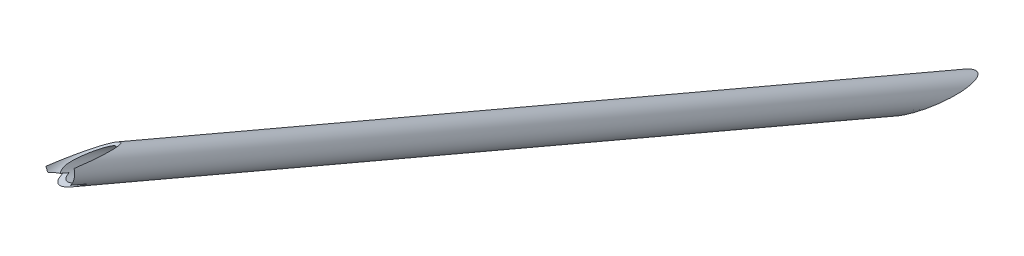
ISO-10303-21;
HEADER;
FILE_DESCRIPTION(('STEP AP214'),'2;1');
FILE_NAME('part.step','',(''),(''),'','','');
FILE_SCHEMA(('AUTOMOTIVE_DESIGN { 1 0 10303 214 1 1 1 1 }'));
ENDSEC;
DATA;
#1=APPLICATION_CONTEXT('core data for automotive mechanical design processes');
#2=APPLICATION_PROTOCOL_DEFINITION('international standard','automotive_design',2000,#1);
#3=PRODUCT_CONTEXT('',#1,'mechanical');
#4=PRODUCT('Part','Part','',(#3));
#5=PRODUCT_RELATED_PRODUCT_CATEGORY('part','',(#4));
#6=PRODUCT_DEFINITION_FORMATION('','',#4);
#7=PRODUCT_DEFINITION_CONTEXT('part definition',#1,'design');
#8=PRODUCT_DEFINITION('design','',#6,#7);
#9=PRODUCT_DEFINITION_SHAPE('','',#8);
#10=(LENGTH_UNIT() NAMED_UNIT(*) SI_UNIT(.MILLI.,.METRE.));
#11=(NAMED_UNIT(*) PLANE_ANGLE_UNIT() SI_UNIT($,.RADIAN.));
#12=(NAMED_UNIT(*) SI_UNIT($,.STERADIAN.) SOLID_ANGLE_UNIT());
#13=UNCERTAINTY_MEASURE_WITH_UNIT(LENGTH_MEASURE(1.E-05),#10,'distance_accuracy_value','');
#14=(GEOMETRIC_REPRESENTATION_CONTEXT(3) GLOBAL_UNCERTAINTY_ASSIGNED_CONTEXT((#13)) GLOBAL_UNIT_ASSIGNED_CONTEXT((#10,
#11,#12)) REPRESENTATION_CONTEXT('',''));
#15=CARTESIAN_POINT('',(0.,0.,0.));
#16=DIRECTION('',(0.,0.,1.));
#17=DIRECTION('',(1.,0.,0.));
#18=AXIS2_PLACEMENT_3D('',#15,#16,#17);
#19=CARTESIAN_POINT('',(-224.999999999997,200.000000000002,-450.));
#20=DIRECTION('',(-0.0876619818920403,0.10519437827043,-0.990580395379929));
#21=DIRECTION('',(0.,0.99440859172735,0.105600912395818));
#22=AXIS2_PLACEMENT_3D('',#19,#20,#21);
#23=CYLINDRICAL_SURFACE('',#22,9.49999999999999);
#24=CARTESIAN_POINT('',(-224.999999999996,200.000000000002,-450.));
#25=DIRECTION('',(-0.375454370679201,0.919670602355291,-0.115065193265995));
#26=DIRECTION('',(-0.00393166272218455,0.122566257616369,0.992452545224283));
#27=AXIS2_PLACEMENT_3D('',#24,#25,#26);
#28=ELLIPSE('',#27,38.9921832232021,9.49999999999999);
#29=CARTESIAN_POINT('',(-216.195090868135,203.54419391161,-450.40282092371));
#30=VERTEX_POINT('',#29);
#31=CARTESIAN_POINT('',(-233.804909131858,196.455806088394,-449.597179076289));
#32=VERTEX_POINT('',#31);
#33=EDGE_CURVE('E88',#30,#32,#28,.T.);
#34=ORIENTED_EDGE('',*,*,#33,.T.);
#35=CARTESIAN_POINT('',(-224.999999999996,200.000000000002,-450.));
#36=DIRECTION('',(-0.00393166272218455,0.122566257616369,0.992452545224283));
#37=DIRECTION('',(-0.375454370679201,0.919670602355291,-0.115065193265995));
#38=AXIS2_PLACEMENT_3D('',#35,#36,#37);
#39=ELLIPSE('',#38,9.79516660998725,9.49999999999999);
#40=CARTESIAN_POINT('',(-232.310278324825,193.934010848774,-449.279820437099));
#41=VERTEX_POINT('',#40);
#42=EDGE_CURVE('E150',#32,#41,#39,.T.);
#43=ORIENTED_EDGE('',*,*,#42,.T.);
#44=CARTESIAN_POINT('',(-223.816060398075,198.579272477696,-436.621482498286));
#45=DIRECTION('',(0.,-0.938783490773442,0.344507703036132));
#46=DIRECTION('',(-0.0976202983177637,-0.342862242025736,-0.934299609520113));
#47=AXIS2_PLACEMENT_3D('',#44,#45,#46);
#48=ELLIPSE('',#47,21.5900591134705,9.49999999999999);
#49=CARTESIAN_POINT('',(-229.53542691,191.925076824251,-454.754165653939));
#50=VERTEX_POINT('',#49);
#51=EDGE_CURVE('E134',#50,#41,#48,.F.);
#52=ORIENTED_EDGE('',*,*,#51,.F.);
#53=CARTESIAN_POINT('',(-224.481813982683,190.718673599658,-452.360341989327));
#54=CARTESIAN_POINT('',(-224.264199666433,190.729885032806,-452.32979248487));
#55=CARTESIAN_POINT('',(-224.046282571827,190.749029245222,-452.304253143446));
#56=CARTESIAN_POINT('',(-223.61148074002,190.803406353677,-452.262531827922));
#57=CARTESIAN_POINT('',(-223.394596457844,190.838645778122,-452.246353656862));
#58=CARTESIAN_POINT('',(-222.963238330348,190.925272406231,-452.222860903455));
#59=CARTESIAN_POINT('',(-222.748768756239,190.976684626942,-452.215560138915));
#60=CARTESIAN_POINT('',(-222.324159344352,191.095427617816,-452.209528193788));
#61=CARTESIAN_POINT('',(-222.114019534059,191.162758488993,-452.21079706758));
#62=CARTESIAN_POINT('',(-221.699768680275,191.312866921458,-452.221701491588));
#63=CARTESIAN_POINT('',(-221.495652386023,191.395630539728,-452.231329518047));
#64=CARTESIAN_POINT('',(-221.094688718717,191.576058876253,-452.258880951925));
#65=CARTESIAN_POINT('',(-220.897841527132,191.673723966204,-452.276804566288));
#66=CARTESIAN_POINT('',(-220.512868010959,191.883142701053,-452.321013521688));
#67=CARTESIAN_POINT('',(-220.324738338526,191.994890875168,-452.347295621753));
#68=CARTESIAN_POINT('',(-219.958413899055,192.231549386845,-452.408440738425));
#69=CARTESIAN_POINT('',(-219.780219081483,192.356459657448,-452.443303711379));
#70=CARTESIAN_POINT('',(-219.434676286924,192.618518885972,-452.522050148405));
#71=CARTESIAN_POINT('',(-219.267347624927,192.755688660111,-452.5659491265));
#72=CARTESIAN_POINT('',(-218.945001801654,193.040711042253,-452.663274909131));
#73=CARTESIAN_POINT('',(-218.789984806616,193.188563794451,-452.716701842285));
#74=CARTESIAN_POINT('',(-218.493212918996,193.493415291667,-452.833846153052));
#75=CARTESIAN_POINT('',(-218.351465464703,193.650419087273,-452.897569248306));
#76=CARTESIAN_POINT('',(-218.082253341881,193.971578842833,-453.036212003403));
#77=CARTESIAN_POINT('',(-217.954788319448,194.135734625429,-453.111131385704));
#78=CARTESIAN_POINT('',(-217.717736128978,194.465016799177,-453.27137867765));
#79=CARTESIAN_POINT('',(-217.607800018386,194.630030305372,-453.356421542661));
#80=CARTESIAN_POINT('',(-217.402859977988,194.962200716982,-453.539407913534));
#81=CARTESIAN_POINT('',(-217.307856128146,195.129357633871,-453.637351488474));
#82=CARTESIAN_POINT('',(-217.133281755478,195.462564459564,-453.847108392444));
#83=CARTESIAN_POINT('',(-217.053683900298,195.628615814699,-453.958896570332));
#84=CARTESIAN_POINT('',(-216.90974232991,195.956547031864,-454.197420433907));
#85=CARTESIAN_POINT('',(-216.845395578067,196.118427718583,-454.324153136463));
#86=CARTESIAN_POINT('',(-216.738008601043,196.416429704804,-454.577679979249));
#87=CARTESIAN_POINT('',(-216.693376118117,196.553384504324,-454.702821997879));
#88=CARTESIAN_POINT('',(-216.615090691642,196.818791932007,-454.964973476775));
#89=CARTESIAN_POINT('',(-216.581436123165,196.947245816211,-455.101981176904));
#90=CARTESIAN_POINT('',(-216.524140871991,197.193519469318,-455.387002172547));
#91=CARTESIAN_POINT('',(-216.500492920459,197.311346908174,-455.535007387242));
#92=CARTESIAN_POINT('',(-216.461924657869,197.535067674153,-455.840840864041));
#93=CARTESIAN_POINT('',(-216.447005437903,197.64095950799,-455.998670351453));
#94=CARTESIAN_POINT('',(-216.4228736521,197.854676122407,-456.34617818612));
#95=CARTESIAN_POINT('',(-216.414810248685,197.960531759763,-456.537145036078));
#96=CARTESIAN_POINT('',(-216.406285500509,198.155916342769,-456.927384795171));
#97=CARTESIAN_POINT('',(-216.405826026521,198.245441265264,-457.126659736233));
#98=CARTESIAN_POINT('',(-216.4107315555,198.409510504716,-457.531803419678));
#99=CARTESIAN_POINT('',(-216.416112991603,198.484011852582,-457.73768917605));
#100=CARTESIAN_POINT('',(-216.431290687141,198.619322394253,-458.153675939583));
#101=CARTESIAN_POINT('',(-216.441086671542,198.680132440702,-458.363776683362));
#102=CARTESIAN_POINT('',(-216.467059283282,198.804416236727,-458.843171205751));
#103=CARTESIAN_POINT('',(-216.484240224404,198.864291088511,-459.113335997373));
#104=CARTESIAN_POINT('',(-216.522433658839,198.968239879304,-459.656472767027));
#105=CARTESIAN_POINT('',(-216.543448056677,199.012305931811,-459.929446076483));
#106=CARTESIAN_POINT('',(-216.588402824986,199.087495113404,-460.477413185907));
#107=CARTESIAN_POINT('',(-216.612348585618,199.118593921607,-460.752409806849));
#108=CARTESIAN_POINT('',(-216.662547388721,199.170027230168,-461.303122839025));
#109=CARTESIAN_POINT('',(-216.688800056408,199.190363475282,-461.578839126304));
#110=CARTESIAN_POINT('',(-216.743469206827,199.222222153879,-462.132560593233));
#111=CARTESIAN_POINT('',(-216.77189991323,199.233680047477,-462.410567954934));
#112=CARTESIAN_POINT('',(-216.830563466706,199.249010638217,-462.966596930744));
#113=CARTESIAN_POINT('',(-216.860796362458,199.252883130381,-463.244618545035));
#114=CARTESIAN_POINT('',(-216.922933299961,199.254200365461,-463.800151115029));
#115=CARTESIAN_POINT('',(-216.954835333123,199.25165266762,-464.077662286643));
#116=CARTESIAN_POINT('',(-217.020316575992,199.241056678745,-464.632388139856));
#117=CARTESIAN_POINT('',(-217.053895859173,199.233008146542,-464.909602807921));
#118=CARTESIAN_POINT('',(-217.126593766605,199.210971347942,-465.494605068874));
#119=CARTESIAN_POINT('',(-217.165912015309,199.196419707393,-465.802346406556));
#120=CARTESIAN_POINT('',(-217.246706133171,199.162196428757,-466.417263728755));
#121=CARTESIAN_POINT('',(-217.288182068965,199.142524632467,-466.724439695507));
#122=CARTESIAN_POINT('',(-217.415997767216,199.076778321222,-467.645087346242));
#123=CARTESIAN_POINT('',(-217.505717996658,199.023975406459,-468.257618737375));
#124=CARTESIAN_POINT('',(-217.695393445402,198.903798289596,-469.480559212412));
#125=CARTESIAN_POINT('',(-217.795363494274,198.836402813598,-470.090963861555));
#126=CARTESIAN_POINT('',(-218.006897780097,198.689126756616,-471.30819744945));
#127=CARTESIAN_POINT('',(-218.118460959846,198.609247313739,-471.915026708925));
#128=CARTESIAN_POINT('',(-218.354573116064,198.438512756771,-473.121732353072));
#129=CARTESIAN_POINT('',(-218.479061730646,198.347708372091,-473.721627701498));
#130=CARTESIAN_POINT('',(-218.74395247641,198.155223738054,-474.916296596135));
#131=CARTESIAN_POINT('',(-218.884357239422,198.053541690165,-475.511069277735));
#132=CARTESIAN_POINT('',(-219.109377525552,197.892756740574,-476.397484552969));
#133=CARTESIAN_POINT('',(-219.186712789555,197.837836250858,-476.691744956377));
#134=CARTESIAN_POINT('',(-219.346804310444,197.72510607377,-477.278226368258));
#135=CARTESIAN_POINT('',(-219.42956035568,197.66729649922,-477.570447455863));
#136=CARTESIAN_POINT('',(-219.601165783286,197.54864830962,-478.152380369849));
#137=CARTESIAN_POINT('',(-219.690013301575,197.487810622764,-478.44209293358));
#138=CARTESIAN_POINT('',(-219.874693500748,197.362866851481,-479.018558716311));
#139=CARTESIAN_POINT('',(-219.970525567329,197.298761054638,-479.305312193039));
#140=CARTESIAN_POINT('',(-220.130397587993,197.193288795865,-479.761325866728));
#141=CARTESIAN_POINT('',(-220.191844409665,197.153068799884,-479.931760548128));
#142=CARTESIAN_POINT('',(-220.317972640347,197.071245048187,-480.271087190585));
#143=CARTESIAN_POINT('',(-220.382654037418,197.02964129758,-480.439979157332));
#144=CARTESIAN_POINT('',(-220.58215284223,196.902540551541,-480.944246247169));
#145=CARTESIAN_POINT('',(-220.722348977235,196.814804432444,-481.276993104666));
#146=CARTESIAN_POINT('',(-220.946085958088,196.677963566957,-481.768222369561));
#147=CARTESIAN_POINT('',(-221.022850230372,196.631509603321,-481.930545570183));
#148=CARTESIAN_POINT('',(-221.181540758231,196.536641987481,-482.252057308153));
#149=CARTESIAN_POINT('',(-221.263466358724,196.488228584248,-482.411246239953));
#150=CARTESIAN_POINT('',(-221.433178074594,196.389260715054,-482.725568774065));
#151=CARTESIAN_POINT('',(-221.520957851907,196.33870858561,-482.880706517021));
#152=CARTESIAN_POINT('',(-221.703421932305,196.235144361607,-483.185993704534));
#153=CARTESIAN_POINT('',(-221.798104169733,196.182133004719,-483.336144622046));
#154=CARTESIAN_POINT('',(-221.979342516769,196.082278411902,-483.605699919149));
#155=CARTESIAN_POINT('',(-222.0646616378,196.035860707316,-483.726089557154));
#156=CARTESIAN_POINT('',(-222.241941876209,195.940812949638,-483.961090347031));
#157=CARTESIAN_POINT('',(-222.333905549949,195.892182047752,-484.075699245771));
#158=CARTESIAN_POINT('',(-222.5251223648,195.792686545643,-484.29679382628));
#159=CARTESIAN_POINT('',(-222.624343983862,195.741831950303,-484.403310966412));
#160=CARTESIAN_POINT('',(-222.831502243308,195.637541592217,-484.606010382251));
#161=CARTESIAN_POINT('',(-222.939429403285,195.584108662118,-484.702203641554));
#162=CARTESIAN_POINT('',(-223.159463559881,195.477340973293,-484.876002380872));
#163=CARTESIAN_POINT('',(-223.271074632263,195.424140903889,-484.954306811413));
#164=CARTESIAN_POINT('',(-223.503814660908,195.315548230783,-485.093734933697));
#165=CARTESIAN_POINT('',(-223.624943270545,195.260155706966,-485.154859250767));
#166=CARTESIAN_POINT('',(-223.877734806375,195.147282109014,-485.254896150507));
#167=CARTESIAN_POINT('',(-224.009520002156,195.08978276466,-485.293490691178));
#168=CARTESIAN_POINT('',(-224.278543855605,194.975495128346,-485.341283402366));
#169=CARTESIAN_POINT('',(-224.415769632502,194.918705531854,-485.350547245338));
#170=CARTESIAN_POINT('',(-224.671146955108,194.815947602272,-485.338485050949));
#171=CARTESIAN_POINT('',(-224.789335819187,194.769562706727,-485.321176348831));
#172=CARTESIAN_POINT('',(-225.021904731613,194.680509990471,-485.264838649128));
#173=CARTESIAN_POINT('',(-225.136280294031,194.637846458398,-485.225784964566));
#174=CARTESIAN_POINT('',(-225.39139505208,194.545001593674,-485.115354243707));
#175=CARTESIAN_POINT('',(-225.529981440618,194.496305231644,-485.03784578116));
#176=CARTESIAN_POINT('',(-225.794888561903,194.406052999751,-484.860920390305));
#177=CARTESIAN_POINT('',(-225.92118123708,194.364513304472,-484.761454964814));
#178=CARTESIAN_POINT('',(-226.147942674441,194.292156192829,-484.559926025454));
#179=CARTESIAN_POINT('',(-226.249704241043,194.260652968011,-484.459526491874));
#180=CARTESIAN_POINT('',(-226.44519212716,194.201730559539,-484.250002799256));
#181=CARTESIAN_POINT('',(-226.538911572195,194.174314855462,-484.140871327049));
#182=CARTESIAN_POINT('',(-226.71947342095,194.122882276232,-483.915926566533));
#183=CARTESIAN_POINT('',(-226.806299107549,194.098873558293,-483.800098146176));
#184=CARTESIAN_POINT('',(-226.973736109608,194.05379506667,-483.563586400528));
#185=CARTESIAN_POINT('',(-227.054349601892,194.032724261393,-483.442904798615));
#186=CARTESIAN_POINT('',(-227.251259230737,193.982616766672,-483.133190742224));
#187=CARTESIAN_POINT('',(-227.363991288224,193.955228286713,-482.941630444878));
#188=CARTESIAN_POINT('',(-227.579253831311,193.905015004412,-482.552235383269));
#189=CARTESIAN_POINT('',(-227.681778854707,193.882192639061,-482.354397333404));
#190=CARTESIAN_POINT('',(-227.878434271696,193.840219018117,-481.953792463317));
#191=CARTESIAN_POINT('',(-227.972549215955,193.821074447387,-481.751017409023));
#192=CARTESIAN_POINT('',(-228.153474788562,193.785849888319,-481.341967185902));
#193=CARTESIAN_POINT('',(-228.240284560379,193.769770259065,-481.135691610038));
#194=CARTESIAN_POINT('',(-228.408060758092,193.7400918139,-480.719235436664));
#195=CARTESIAN_POINT('',(-228.488990908104,193.726507718888,-480.509039248799));
#196=CARTESIAN_POINT('',(-228.645251011914,193.701533965887,-480.086447271167));
#197=CARTESIAN_POINT('',(-228.720580767768,193.690144385439,-479.874051403955));
#198=CARTESIAN_POINT('',(-228.866178332138,193.66925228651,-479.447734235051));
#199=CARTESIAN_POINT('',(-228.936452179779,193.65974749204,-479.233815100332));
#200=CARTESIAN_POINT('',(-229.072542309438,193.642346811088,-478.80450447894));
#201=CARTESIAN_POINT('',(-229.138358598611,193.634450922024,-478.58911299463));
#202=CARTESIAN_POINT('',(-229.294814342971,193.616789363193,-478.059366040877));
#203=CARTESIAN_POINT('',(-229.383213421308,193.607793828285,-477.74432262669));
#204=CARTESIAN_POINT('',(-229.55249778892,193.592177252905,-477.112154467586));
#205=CARTESIAN_POINT('',(-229.633382539982,193.585556382419,-476.795029575324));
#206=CARTESIAN_POINT('',(-229.788415503808,193.574235707231,-476.159021748865));
#207=CARTESIAN_POINT('',(-229.862561994087,193.569536392662,-475.840138387129));
#208=CARTESIAN_POINT('',(-230.004682760881,193.561673503172,-475.200976509497));
#209=CARTESIAN_POINT('',(-230.072656826983,193.558509980589,-474.880697946431));
#210=CARTESIAN_POINT('',(-230.268283314793,193.550789778809,-473.916886831128));
#211=CARTESIAN_POINT('',(-230.387350142008,193.548022200463,-473.271585387439));
#212=CARTESIAN_POINT('',(-230.605059142365,193.544747466169,-471.977686170171));
#213=CARTESIAN_POINT('',(-230.703704480907,193.544239959652,-471.329088923446));
#214=CARTESIAN_POINT('',(-230.881410452283,193.543024412357,-470.031476252558));
#215=CARTESIAN_POINT('',(-230.960536735176,193.542317061445,-469.382469799732));
#216=CARTESIAN_POINT('',(-231.099632949312,193.537947713242,-468.082285827802));
#217=CARTESIAN_POINT('',(-231.159599829094,193.534285245626,-467.431107979538));
#218=CARTESIAN_POINT('',(-231.234029662485,193.523913199196,-466.453768900658));
#219=CARTESIAN_POINT('',(-231.256240991116,193.519648282526,-466.128160998165));
#220=CARTESIAN_POINT('',(-231.295148982499,193.508923094402,-465.476655236452));
#221=CARTESIAN_POINT('',(-231.3118458126,193.502462889582,-465.150757386331));
#222=CARTESIAN_POINT('',(-231.339220239108,193.486683064575,-464.498858974558));
#223=CARTESIAN_POINT('',(-231.349899391347,193.477364184443,-464.172858461277));
#224=CARTESIAN_POINT('',(-231.364532499175,193.455051810348,-463.520841761194));
#225=CARTESIAN_POINT('',(-231.368486947668,193.442058585786,-463.194825577291));
#226=CARTESIAN_POINT('',(-231.368626372654,193.41852859658,-462.694801359247));
#227=CARTESIAN_POINT('',(-231.36757211065,193.409666126491,-462.520713768169));
#228=CARTESIAN_POINT('',(-231.363054863072,193.39041757281,-462.172655961119));
#229=CARTESIAN_POINT('',(-231.359591886111,193.380031494667,-461.998685744729));
#230=CARTESIAN_POINT('',(-231.345254591859,193.34628563819,-461.476960621394));
#231=CARTESIAN_POINT('',(-231.330431725395,193.320341232743,-461.12945811484));
#232=CARTESIAN_POINT('',(-231.287850224618,193.259649156387,-460.436148933075));
#233=CARTESIAN_POINT('',(-231.260097801698,193.224905716213,-460.090341524055));
#234=CARTESIAN_POINT('',(-231.188212259777,193.144214754468,-459.401734990135));
#235=CARTESIAN_POINT('',(-231.144084905061,193.098271177506,-459.058934850037));
#236=CARTESIAN_POINT('',(-231.05265189485,193.009891996258,-458.491265947692));
#237=CARTESIAN_POINT('',(-231.011215194965,192.971314177532,-458.264859921972));
#238=CARTESIAN_POINT('',(-230.916878129892,192.887025367696,-457.815719242847));
#239=CARTESIAN_POINT('',(-230.863977018401,192.841313912258,-457.59298482947));
#240=CARTESIAN_POINT('',(-230.744626266652,192.742154892151,-457.153384939064));
#241=CARTESIAN_POINT('',(-230.678204694841,192.688723419849,-456.936508340971));
#242=CARTESIAN_POINT('',(-230.529344071538,192.573728415826,-456.510526084373));
#243=CARTESIAN_POINT('',(-230.446911234456,192.512168042113,-456.3014174483));
#244=CARTESIAN_POINT('',(-230.285888539184,192.397142994371,-455.943121269761));
#245=CARTESIAN_POINT('',(-230.211182071891,192.345315835351,-455.791662812058));
#246=CARTESIAN_POINT('',(-230.050479182536,192.237818153255,-455.496304909392));
#247=CARTESIAN_POINT('',(-229.964486013482,192.182148739762,-455.352403303092));
#248=CARTESIAN_POINT('',(-229.780816785449,192.06797408841,-455.073609331465));
#249=CARTESIAN_POINT('',(-229.683149929238,192.00947110571,-454.938709998385));
#250=CARTESIAN_POINT('',(-229.476059263579,191.890939841126,-454.678964167205));
#251=CARTESIAN_POINT('',(-229.366635337647,191.830911544135,-454.554117768728));
#252=CARTESIAN_POINT('',(-229.136271257158,191.710852272631,-454.31508970602));
#253=CARTESIAN_POINT('',(-229.015312089176,191.650821462598,-454.200926286054));
#254=CARTESIAN_POINT('',(-228.762849232221,191.532600909152,-453.983866674344));
#255=CARTESIAN_POINT('',(-228.631345132302,191.474411237613,-453.880970922083));
#256=CARTESIAN_POINT('',(-228.358682877842,191.36149356301,-453.686254215161));
#257=CARTESIAN_POINT('',(-228.217511052179,191.306770681834,-453.594449473032));
#258=CARTESIAN_POINT('',(-227.926901252744,191.202422856501,-453.42169598911));
#259=CARTESIAN_POINT('',(-227.777463211679,191.152797953851,-453.340747335711));
#260=CARTESIAN_POINT('',(-227.472654621777,191.060298501629,-453.189641964618));
#261=CARTESIAN_POINT('',(-227.317333536535,191.01737866913,-453.119412932863));
#262=CARTESIAN_POINT('',(-227.000958763878,190.938935171844,-452.988377288671));
#263=CARTESIAN_POINT('',(-226.839904805528,190.903411857159,-452.927571122287));
#264=CARTESIAN_POINT('',(-226.513386620887,190.840654217381,-452.81474955634));
#265=CARTESIAN_POINT('',(-226.347927542747,190.813410641781,-452.762724375379));
#266=CARTESIAN_POINT('',(-226.013529881601,190.767828155733,-452.666733526145));
#267=CARTESIAN_POINT('',(-225.844591976389,190.74948752748,-452.622766304126));
#268=CARTESIAN_POINT('',(-225.478018770932,190.720113325684,-452.53609075023));
#269=CARTESIAN_POINT('',(-225.279964748241,190.710636749434,-452.494615296501));
#270=CARTESIAN_POINT('',(-224.88196404113,190.704758939275,-452.420793030515));
#271=CARTESIAN_POINT('',(-224.682017145136,190.708359184639,-452.388447251468));
#272=CARTESIAN_POINT('',(-224.481813982683,190.718673599658,-452.360341989327));
#273=B_SPLINE_CURVE_WITH_KNOTS('',3,(#53,#54,#55,#56,#57,#58,#59,#60,#61,#62,#63,#64,#65,#66,
#67,#68,#69,#70,#71,#72,#73,#74,#75,#76,#77,#78,#79,#80,#81,#82,#83,#84,#85,#86,#87,#88,#89,#90,
#91,#92,#93,#94,#95,#96,#97,#98,#99,#100,#101,#102,#103,#104,#105,#106,#107,#108,#109,#110,#111,
#112,#113,#114,#115,#116,#117,#118,#119,#120,#121,#122,#123,#124,#125,#126,#127,#128,#129,#130,
#131,#132,#133,#134,#135,#136,#137,#138,#139,#140,#141,#142,#143,#144,#145,#146,#147,#148,#149,
#150,#151,#152,#153,#154,#155,#156,#157,#158,#159,#160,#161,#162,#163,#164,#165,#166,#167,#168,
#169,#170,#171,#172,#173,#174,#175,#176,#177,#178,#179,#180,#181,#182,#183,#184,#185,#186,#187,
#188,#189,#190,#191,#192,#193,#194,#195,#196,#197,#198,#199,#200,#201,#202,#203,#204,#205,#206,
#207,#208,#209,#210,#211,#212,#213,#214,#215,#216,#217,#218,#219,#220,#221,#222,#223,#224,#225,
#226,#227,#228,#229,#230,#231,#232,#233,#234,#235,#236,#237,#238,#239,#240,#241,#242,#243,#244,
#245,#246,#247,#248,#249,#250,#251,#252,#253,#254,#255,#256,#257,#258,#259,#260,#261,#262,#263,
#264,#265,#266,#267,#268,#269,#270,#271,#272),.UNSPECIFIED.,.T.,.F.,(4,2,2,2,2,2,2,2,2,2,2,2,2,
2,2,2,2,2,2,2,2,2,2,2,2,2,2,2,2,2,2,2,2,2,2,2,2,2,2,2,2,2,2,2,2,2,2,2,2,2,2,2,2,2,2,2,2,2,2,2,2,
2,2,2,2,2,2,2,2,2,2,2,2,2,2,2,2,2,2,2,2,2,2,2,2,2,2,2,2,2,2,2,2,2,2,2,2,2,2,2,2,2,2,2,2,2,2,2,2,
4),(0.,0.659919907632191,1.32010772448997,1.98132182294483,2.6425401172636,3.30316389026774,
3.96380414428329,4.62418854931303,5.28456959495288,5.94609405808923,6.60762745183921,
7.269529477383,7.93141509801357,8.57779061177804,9.22416958678984,9.86939106801969,
10.5144839715905,11.0860786356193,11.6575886549516,12.2286828121769,12.7998483409386,
13.4542889429758,14.1088905527355,14.7653386397864,15.4217458344105,16.2528627140241,
17.0843936364595,17.9174772076037,18.7504256833626,19.5893737855147,20.4283445578682,
21.2663279730065,22.1043481295778,23.0360412096593,23.9677630806304,25.8313883894807,
27.6977491177786,29.5639397977274,31.4217770958613,33.2799220479264,34.2073786706958,
35.1347991033133,36.0619369877198,36.9889934271582,37.5457061491074,38.1024168164805,
39.2165504604046,39.7728821356131,40.3291433423763,40.8848117907108,41.4403146248778,
41.9041576712259,42.368180132246,42.8302949488692,43.2919131424525,43.7299270471572,
44.1679250068774,44.6119651308866,45.0550103279049,45.4373520989358,45.8201288284589,
46.3156060028051,46.8121887058207,47.2507015313707,47.6895855434082,48.1295032423975,
48.5692660815324,49.2406065012447,49.9123042731651,50.5852116237697,51.2581977632146,
51.935034532095,52.6118952121404,53.2879334977693,53.9639706984422,54.9458478355641,
55.9277952453018,56.909992965857,57.8922241562123,59.8604072124153,61.8282849647957,
63.7894508732204,65.7509289751607,66.7300639010372,67.7091691102632,68.688021061934,
69.6668012632006,70.189728719888,70.7126543066059,71.7587062027487,72.804256090112,
73.8494382727758,74.5492366930598,75.2490806821486,75.947486348662,76.6456214845236,
77.1750832193983,77.7043926886679,78.2332876036682,78.7621877592376,79.2919752810922,
79.8217834593848,80.3523569588825,80.8829347781599,81.4097580414303,81.9366062353774,
82.4628636278573,82.9890194396187,83.5960709910342,84.2031912152471),.UNSPECIFIED.);
#274=CARTESIAN_POINT('',(-219.301386014969,192.730719815022,-452.558788504071));
#275=VERTEX_POINT('',#274);
#276=EDGE_CURVE('E46',#275,#50,#273,.T.);
#277=ORIENTED_EDGE('',*,*,#276,.F.);
#278=CARTESIAN_POINT('',(-223.816060398075,198.579272477696,-436.621482498286));
#279=DIRECTION('',(0.,-0.938783490773442,0.344507703036132));
#280=DIRECTION('',(-0.0976202983177637,-0.342862242025736,-0.934299609520113));
#281=AXIS2_PLACEMENT_3D('',#278,#279,#280);
#282=ELLIPSE('',#281,21.5900591134705,9.49999999999999);
#283=CARTESIAN_POINT('',(-217.424826478925,193.954712860681,-449.22340745465));
#284=VERTEX_POINT('',#283);
#285=EDGE_CURVE('E158',#284,#275,#282,.F.);
#286=ORIENTED_EDGE('',*,*,#285,.F.);
#287=CARTESIAN_POINT('',(-224.999999999996,200.000000000002,-450.));
#288=DIRECTION('',(-0.00393166272218455,0.122566257616369,0.992452545224283));
#289=DIRECTION('',(-0.375454370679201,0.919670602355291,-0.115065193265995));
#290=AXIS2_PLACEMENT_3D('',#287,#288,#289);
#291=ELLIPSE('',#290,9.79516660998725,9.49999999999999);
#292=EDGE_CURVE('E152',#284,#30,#291,.T.);
#293=ORIENTED_EDGE('',*,*,#292,.T.);
#294=EDGE_LOOP('',(#34,#43,#52,#277,#286,#293));
#295=FACE_BOUND('',#294,.T.);
#296=ADVANCED_FACE('F41',(#295),#23,.F.);
#297=CARTESIAN_POINT('',(-1454.82927770514,6235.65806886261,16014.4182376503));
#298=DIRECTION('',(0.,-0.938783490773442,0.344507703036132));
#299=DIRECTION('',(0.,-0.344507703036132,-0.938783490773441));
#300=AXIS2_PLACEMENT_3D('',#297,#298,#299);
#301=PLANE('',#300);
#302=DIRECTION('',(0.0952883546425905,-0.342940093829426,-0.934511755685166));
#303=VECTOR('',#302,1.);
#304=CARTESIAN_POINT('',(-1896.15525896778,6235.65806886261,16014.4182376503));
#305=LINE('',#304,#303);
#306=CARTESIAN_POINT('',(-216.325981262636,190.000000000002,-460.));
#307=VERTEX_POINT('',#306);
#308=EDGE_CURVE('E63',#284,#307,#305,.T.);
#309=ORIENTED_EDGE('',*,*,#308,.F.);
#310=ORIENTED_EDGE('',*,*,#285,.T.);
#311=DIRECTION('',(0.0952883546425905,-0.342940093829426,-0.934511755685166));
#312=VECTOR('',#311,1.);
#313=CARTESIAN_POINT('',(-1898.37191371437,6235.65806886261,16014.4182376503));
#314=LINE('',#313,#312);
#315=CARTESIAN_POINT('',(-218.542636009224,190.000000000002,-460.));
#316=VERTEX_POINT('',#315);
#317=EDGE_CURVE('E156',#275,#316,#314,.T.);
#318=ORIENTED_EDGE('',*,*,#317,.T.);
#319=DIRECTION('',(-1.,0.,0.));
#320=VECTOR('',#319,1.);
#321=CARTESIAN_POINT('',(225.000000000003,190.,-460.000000000006));
#322=LINE('',#321,#320);
#323=EDGE_CURVE('E11',#307,#316,#322,.T.);
#324=ORIENTED_EDGE('',*,*,#323,.F.);
#325=EDGE_LOOP('',(#309,#310,#318,#324));
#326=FACE_BOUND('',#325,.T.);
#327=ADVANCED_FACE('F170',(#326),#301,.T.);
#328=CARTESIAN_POINT('',(-169.428571428575,-1.81799020282369E-12,-995.));
#329=DIRECTION('',(-0.0952883546425905,0.342940093829426,0.934511755685166));
#330=DIRECTION('',(0.,-0.938783490773442,0.344507703036132));
#331=AXIS2_PLACEMENT_3D('',#328,#329,#330);
#332=CYLINDRICAL_SURFACE('',#331,9.49999999999999);
#333=ORIENTED_EDGE('',*,*,#308,.T.);
#334=CARTESIAN_POINT('',(-222.221428571425,190.000000000002,-477.250000000001));
#335=DIRECTION('',(0.,1.,0.));
#336=DIRECTION('',(-0.101439949498838,0.,0.994841664108251));
#337=AXIS2_PLACEMENT_3D('',#334,#335,#336);
#338=ELLIPSE('',#337,27.7016311913804,9.49999999999999);
#339=CARTESIAN_POINT('',(-231.217185310417,190.000000000002,-460.));
#340=VERTEX_POINT('',#339);
#341=EDGE_CURVE('E124',#340,#307,#338,.T.);
#342=ORIENTED_EDGE('',*,*,#341,.F.);
#343=DIRECTION('',(0.0952883546425905,-0.342940093829426,-0.934511755685166));
#344=VECTOR('',#343,1.);
#345=CARTESIAN_POINT('',(-1911.04646301556,6235.65806886261,16014.4182376503));
#346=LINE('',#345,#344);
#347=EDGE_CURVE('E145',#41,#340,#346,.T.);
#348=ORIENTED_EDGE('',*,*,#347,.F.);
#349=ORIENTED_EDGE('',*,*,#42,.F.);
#350=ORIENTED_EDGE('',*,*,#33,.F.);
#351=ORIENTED_EDGE('',*,*,#292,.F.);
#352=EDGE_LOOP('',(#333,#342,#348,#349,#350,#351));
#353=FACE_BOUND('',#352,.T.);
#354=CARTESIAN_POINT('',(-172.207142857146,9.9999999999984,-967.749999999999));
#355=DIRECTION('',(0.,-1.,0.));
#356=DIRECTION('',(-0.101439949498838,0.,0.994841664108251));
#357=AXIS2_PLACEMENT_3D('',#354,#355,#356);
#358=ELLIPSE('',#357,27.7016311913804,9.49999999999999);
#359=CARTESIAN_POINT('',(-178.29106968644,9.99999999999834,-984.477284987271));
#360=VERTEX_POINT('',#359);
#361=CARTESIAN_POINT('',(-173.261818317507,9.99999999999856,-940.471335509112));
#362=VERTEX_POINT('',#361);
#363=EDGE_CURVE('E117',#360,#362,#358,.T.);
#364=ORIENTED_EDGE('',*,*,#363,.F.);
#365=CARTESIAN_POINT('',(-174.174415873272,17.0801599552076,-948.456564122055));
#366=DIRECTION('',(0.993532672656403,0.,-0.113546591160743));
#367=DIRECTION('',(0.106361808887804,0.350068968397222,0.930665827768173));
#368=AXIS2_PLACEMENT_3D('',#365,#366,#367);
#369=ELLIPSE('',#368,47.3148291768965,9.49999999999999);
#370=EDGE_CURVE('E125',#362,#360,#369,.T.);
#371=ORIENTED_EDGE('',*,*,#370,.F.);
#372=EDGE_LOOP('',(#364,#371));
#373=FACE_BOUND('',#372,.T.);
#374=ADVANCED_FACE('F132',(#353,#373),#332,.T.);
#375=CARTESIAN_POINT('',(-169.428571428575,-1.81799020282369E-12,-995.));
#376=DIRECTION('',(-0.0952883546425905,0.342940093829426,0.934511755685166));
#377=DIRECTION('',(0.,-0.938783490773442,0.344507703036132));
#378=AXIS2_PLACEMENT_3D('',#375,#376,#377);
#379=CYLINDRICAL_SURFACE('',#378,7.90000000000002);
#380=ORIENTED_EDGE('',*,*,#276,.T.);
#381=DIRECTION('',(0.0952883546425905,-0.342940093829426,-0.934511755685166));
#382=VECTOR('',#381,1.);
#383=CARTESIAN_POINT('',(-1908.82980826897,6235.65806886261,16014.4182376503));
#384=LINE('',#383,#382);
#385=CARTESIAN_POINT('',(-229.000530563829,190.000000000002,-460.));
#386=VERTEX_POINT('',#385);
#387=EDGE_CURVE('E82',#50,#386,#384,.T.);
#388=ORIENTED_EDGE('',*,*,#387,.T.);
#389=CARTESIAN_POINT('',(-222.221428571425,190.000000000002,-477.250000000001));
#390=DIRECTION('',(0.,1.,0.));
#391=DIRECTION('',(-0.101439949498838,0.,0.994841664108251));
#392=AXIS2_PLACEMENT_3D('',#389,#390,#391);
#393=ELLIPSE('',#392,23.0360933065164,7.90000000000002);
#394=EDGE_CURVE('E140',#386,#316,#393,.T.);
#395=ORIENTED_EDGE('',*,*,#394,.T.);
#396=ORIENTED_EDGE('',*,*,#317,.F.);
#397=EDGE_LOOP('',(#380,#388,#395,#396));
#398=FACE_BOUND('',#397,.T.);
#399=CARTESIAN_POINT('',(-174.174415873272,17.0801599552076,-948.456564122055));
#400=DIRECTION('',(0.993532672656403,0.,-0.113546591160743));
#401=DIRECTION('',(0.106361808887804,0.350068968397222,0.930665827768173));
#402=AXIS2_PLACEMENT_3D('',#399,#400,#401);
#403=ELLIPSE('',#402,39.3460158418404,7.90000000000002);
#404=CARTESIAN_POINT('',(-173.763867136424,9.99999999999854,-944.86426267464));
#405=VERTEX_POINT('',#404);
#406=CARTESIAN_POINT('',(-177.789020867522,9.99999999999836,-980.084357821744));
#407=VERTEX_POINT('',#406);
#408=EDGE_CURVE('E141',#405,#407,#403,.T.);
#409=ORIENTED_EDGE('',*,*,#408,.T.);
#410=CARTESIAN_POINT('',(-172.207142857146,9.9999999999984,-967.749999999999));
#411=DIRECTION('',(0.,-1.,0.));
#412=DIRECTION('',(-0.101439949498838,0.,0.994841664108251));
#413=AXIS2_PLACEMENT_3D('',#410,#411,#412);
#414=ELLIPSE('',#413,23.0360933065164,7.90000000000002);
#415=EDGE_CURVE('E120',#407,#405,#414,.T.);
#416=ORIENTED_EDGE('',*,*,#415,.T.);
#417=EDGE_LOOP('',(#409,#416));
#418=FACE_BOUND('',#417,.T.);
#419=ADVANCED_FACE('F43',(#398,#418),#379,.F.);
#420=CARTESIAN_POINT('',(-1454.82927770514,6235.65806886261,16014.4182376503));
#421=DIRECTION('',(0.,-0.938783490773442,0.344507703036132));
#422=DIRECTION('',(0.,-0.344507703036132,-0.938783490773441));
#423=AXIS2_PLACEMENT_3D('',#420,#421,#422);
#424=PLANE('',#423);
#425=ORIENTED_EDGE('',*,*,#387,.F.);
#426=ORIENTED_EDGE('',*,*,#51,.T.);
#427=ORIENTED_EDGE('',*,*,#347,.T.);
#428=DIRECTION('',(-1.,0.,0.));
#429=VECTOR('',#428,1.);
#430=CARTESIAN_POINT('',(225.000000000003,190.,-460.000000000006));
#431=LINE('',#430,#429);
#432=EDGE_CURVE('E147',#386,#340,#431,.T.);
#433=ORIENTED_EDGE('',*,*,#432,.F.);
#434=EDGE_LOOP('',(#425,#426,#427,#433));
#435=FACE_BOUND('',#434,.T.);
#436=ADVANCED_FACE('F163',(#435),#424,.T.);
#437=CARTESIAN_POINT('',(-259.935326726576,-10.0000000000055,-1698.86453408839));
#438=DIRECTION('',(0.993532672656403,0.,-0.113546591160743));
#439=DIRECTION('',(-0.113546591160743,0.,-0.993532672656403));
#440=AXIS2_PLACEMENT_3D('',#437,#438,#439);
#441=PLANE('',#440);
#442=DIRECTION('',(0.113546591160743,0.,0.993532672656403));
#443=VECTOR('',#442,1.);
#444=CARTESIAN_POINT('',(-259.935326726576,9.99999999999456,-1698.86453408839));
#445=LINE('',#444,#443);
#446=EDGE_CURVE('E129',#405,#362,#445,.T.);
#447=ORIENTED_EDGE('',*,*,#446,.T.);
#448=ORIENTED_EDGE('',*,*,#370,.T.);
#449=DIRECTION('',(0.113546591160743,0.,0.993532672656403));
#450=VECTOR('',#449,1.);
#451=CARTESIAN_POINT('',(-259.935326726576,9.99999999999456,-1698.86453408839));
#452=LINE('',#451,#450);
#453=EDGE_CURVE('E113',#360,#407,#452,.T.);
#454=ORIENTED_EDGE('',*,*,#453,.T.);
#455=ORIENTED_EDGE('',*,*,#408,.F.);
#456=EDGE_LOOP('',(#447,#448,#454,#455));
#457=FACE_BOUND('',#456,.T.);
#458=ADVANCED_FACE('F128',(#457),#441,.T.);
#459=CARTESIAN_POINT('',(225.000000000003,190.,-460.000000000006));
#460=DIRECTION('',(0.,1.,0.));
#461=DIRECTION('',(0.,0.,1.));
#462=AXIS2_PLACEMENT_3D('',#459,#460,#461);
#463=PLANE('',#462);
#464=ORIENTED_EDGE('',*,*,#432,.T.);
#465=ORIENTED_EDGE('',*,*,#341,.T.);
#466=ORIENTED_EDGE('',*,*,#323,.T.);
#467=ORIENTED_EDGE('',*,*,#394,.F.);
#468=EDGE_LOOP('',(#464,#465,#466,#467));
#469=FACE_BOUND('',#468,.T.);
#470=ADVANCED_FACE('F166',(#469),#463,.T.);
#471=CARTESIAN_POINT('',(-259.935326726576,9.99999999999456,-1698.86453408839));
#472=DIRECTION('',(0.,-1.,0.));
#473=DIRECTION('',(0.,0.,-1.));
#474=AXIS2_PLACEMENT_3D('',#471,#472,#473);
#475=PLANE('',#474);
#476=ORIENTED_EDGE('',*,*,#453,.F.);
#477=ORIENTED_EDGE('',*,*,#363,.T.);
#478=ORIENTED_EDGE('',*,*,#446,.F.);
#479=ORIENTED_EDGE('',*,*,#415,.F.);
#480=EDGE_LOOP('',(#476,#477,#478,#479));
#481=FACE_BOUND('',#480,.T.);
#482=ADVANCED_FACE('F115',(#481),#475,.T.);
#483=CLOSED_SHELL('',(#296,#327,#374,#419,#436,#458,#470,#482));
#484=MANIFOLD_SOLID_BREP('B2',#483);
#485=ADVANCED_BREP_SHAPE_REPRESENTATION('',(#18,#484),#14);
#486=SHAPE_DEFINITION_REPRESENTATION(#9,#485);
ENDSEC;
END-ISO-10303-21;
